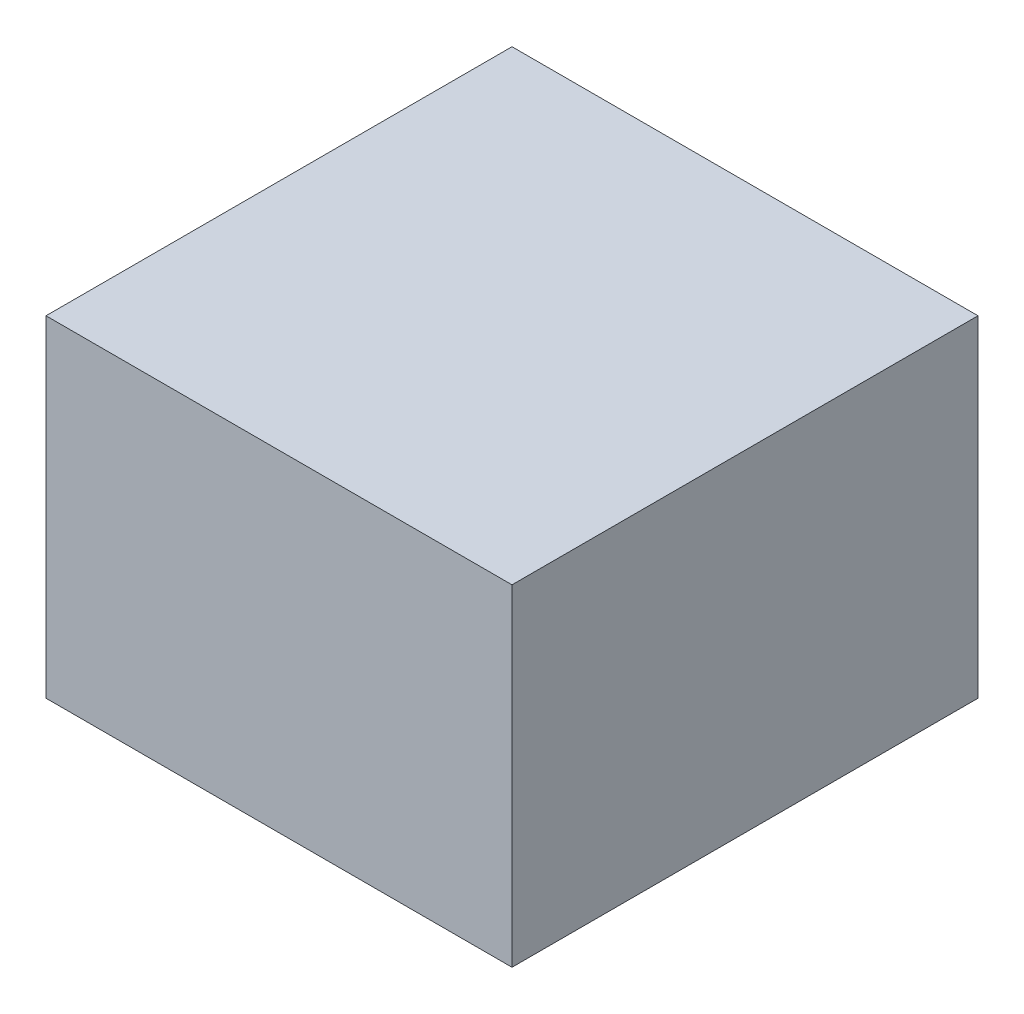
ISO-10303-21;
HEADER;
FILE_DESCRIPTION(('STEP AP214'),'2;1');
FILE_NAME('part.step','',(''),(''),'','','');
FILE_SCHEMA(('AUTOMOTIVE_DESIGN { 1 0 10303 214 1 1 1 1 }'));
ENDSEC;
DATA;
#1=APPLICATION_CONTEXT('core data for automotive mechanical design processes');
#2=APPLICATION_PROTOCOL_DEFINITION('international standard','automotive_design',2000,#1);
#3=PRODUCT_CONTEXT('',#1,'mechanical');
#4=PRODUCT('Part','Part','',(#3));
#5=PRODUCT_RELATED_PRODUCT_CATEGORY('part','',(#4));
#6=PRODUCT_DEFINITION_FORMATION('','',#4);
#7=PRODUCT_DEFINITION_CONTEXT('part definition',#1,'design');
#8=PRODUCT_DEFINITION('design','',#6,#7);
#9=PRODUCT_DEFINITION_SHAPE('','',#8);
#10=(LENGTH_UNIT() NAMED_UNIT(*) SI_UNIT(.MILLI.,.METRE.));
#11=(NAMED_UNIT(*) PLANE_ANGLE_UNIT() SI_UNIT($,.RADIAN.));
#12=(NAMED_UNIT(*) SI_UNIT($,.STERADIAN.) SOLID_ANGLE_UNIT());
#13=UNCERTAINTY_MEASURE_WITH_UNIT(LENGTH_MEASURE(1.E-05),#10,'distance_accuracy_value','');
#14=(GEOMETRIC_REPRESENTATION_CONTEXT(3) GLOBAL_UNCERTAINTY_ASSIGNED_CONTEXT((#13)) GLOBAL_UNIT_ASSIGNED_CONTEXT((#10,
#11,#12)) REPRESENTATION_CONTEXT('',''));
#15=CARTESIAN_POINT('',(0.,0.,0.));
#16=DIRECTION('',(0.,0.,1.));
#17=DIRECTION('',(1.,0.,0.));
#18=AXIS2_PLACEMENT_3D('',#15,#16,#17);
#19=CARTESIAN_POINT('',(18.5,26.3,18.5));
#20=DIRECTION('',(-1.,0.,0.));
#21=DIRECTION('',(0.,0.,1.));
#22=AXIS2_PLACEMENT_3D('',#19,#20,#21);
#23=PLANE('',#22);
#24=DIRECTION('',(0.,0.,-1.));
#25=VECTOR('',#24,1.);
#26=CARTESIAN_POINT('',(18.5,0.,18.5));
#27=LINE('',#26,#25);
#28=CARTESIAN_POINT('',(18.5,0.,18.5));
#29=VERTEX_POINT('',#28);
#30=CARTESIAN_POINT('',(18.5,0.,-18.5));
#31=VERTEX_POINT('',#30);
#32=EDGE_CURVE('E107',#29,#31,#27,.T.);
#33=ORIENTED_EDGE('',*,*,#32,.T.);
#34=DIRECTION('',(0.,-1.,0.));
#35=VECTOR('',#34,1.);
#36=CARTESIAN_POINT('',(18.5,26.3,-18.5));
#37=LINE('',#36,#35);
#38=CARTESIAN_POINT('',(18.5,26.3,-18.5));
#39=VERTEX_POINT('',#38);
#40=EDGE_CURVE('E11',#39,#31,#37,.T.);
#41=ORIENTED_EDGE('',*,*,#40,.F.);
#42=DIRECTION('',(0.,0.,-1.));
#43=VECTOR('',#42,1.);
#44=CARTESIAN_POINT('',(18.5,26.3,18.5));
#45=LINE('',#44,#43);
#46=CARTESIAN_POINT('',(18.5,26.3,18.5));
#47=VERTEX_POINT('',#46);
#48=EDGE_CURVE('E91',#47,#39,#45,.T.);
#49=ORIENTED_EDGE('',*,*,#48,.F.);
#50=DIRECTION('',(0.,-1.,0.));
#51=VECTOR('',#50,1.);
#52=CARTESIAN_POINT('',(18.5,26.3,18.5));
#53=LINE('',#52,#51);
#54=EDGE_CURVE('E103',#47,#29,#53,.T.);
#55=ORIENTED_EDGE('',*,*,#54,.T.);
#56=EDGE_LOOP('',(#33,#41,#49,#55));
#57=FACE_BOUND('',#56,.T.);
#58=ADVANCED_FACE('F39',(#57),#23,.F.);
#59=CARTESIAN_POINT('',(-18.5,26.3,-18.5));
#60=DIRECTION('',(0.,0.,1.));
#61=DIRECTION('',(1.,0.,0.));
#62=AXIS2_PLACEMENT_3D('',#59,#60,#61);
#63=PLANE('',#62);
#64=DIRECTION('',(-1.,0.,0.));
#65=VECTOR('',#64,1.);
#66=CARTESIAN_POINT('',(-18.5,0.,-18.5));
#67=LINE('',#66,#65);
#68=CARTESIAN_POINT('',(-18.5,0.,-18.5));
#69=VERTEX_POINT('',#68);
#70=EDGE_CURVE('E96',#31,#69,#67,.T.);
#71=ORIENTED_EDGE('',*,*,#70,.T.);
#72=DIRECTION('',(0.,-1.,0.));
#73=VECTOR('',#72,1.);
#74=CARTESIAN_POINT('',(-18.5,26.3,-18.5));
#75=LINE('',#74,#73);
#76=CARTESIAN_POINT('',(-18.5,26.3,-18.5));
#77=VERTEX_POINT('',#76);
#78=EDGE_CURVE('E48',#77,#69,#75,.T.);
#79=ORIENTED_EDGE('',*,*,#78,.F.);
#80=DIRECTION('',(-1.,0.,0.));
#81=VECTOR('',#80,1.);
#82=CARTESIAN_POINT('',(-18.5,26.3,-18.5));
#83=LINE('',#82,#81);
#84=EDGE_CURVE('E86',#39,#77,#83,.T.);
#85=ORIENTED_EDGE('',*,*,#84,.F.);
#86=ORIENTED_EDGE('',*,*,#40,.T.);
#87=EDGE_LOOP('',(#71,#79,#85,#86));
#88=FACE_BOUND('',#87,.T.);
#89=ADVANCED_FACE('F95',(#88),#63,.F.);
#90=CARTESIAN_POINT('',(-18.5,26.3,18.5));
#91=DIRECTION('',(1.,0.,0.));
#92=DIRECTION('',(0.,0.,-1.));
#93=AXIS2_PLACEMENT_3D('',#90,#91,#92);
#94=PLANE('',#93);
#95=DIRECTION('',(0.,0.,1.));
#96=VECTOR('',#95,1.);
#97=CARTESIAN_POINT('',(-18.5,0.,18.5));
#98=LINE('',#97,#96);
#99=CARTESIAN_POINT('',(-18.5,0.,18.5));
#100=VERTEX_POINT('',#99);
#101=EDGE_CURVE('E73',#69,#100,#98,.T.);
#102=ORIENTED_EDGE('',*,*,#101,.T.);
#103=DIRECTION('',(0.,-1.,0.));
#104=VECTOR('',#103,1.);
#105=CARTESIAN_POINT('',(-18.5,26.3,18.5));
#106=LINE('',#105,#104);
#107=CARTESIAN_POINT('',(-18.5,26.3,18.5));
#108=VERTEX_POINT('',#107);
#109=EDGE_CURVE('E98',#108,#100,#106,.T.);
#110=ORIENTED_EDGE('',*,*,#109,.F.);
#111=DIRECTION('',(0.,0.,1.));
#112=VECTOR('',#111,1.);
#113=CARTESIAN_POINT('',(-18.5,26.3,18.5));
#114=LINE('',#113,#112);
#115=EDGE_CURVE('E89',#77,#108,#114,.T.);
#116=ORIENTED_EDGE('',*,*,#115,.F.);
#117=ORIENTED_EDGE('',*,*,#78,.T.);
#118=EDGE_LOOP('',(#102,#110,#116,#117));
#119=FACE_BOUND('',#118,.T.);
#120=ADVANCED_FACE('F99',(#119),#94,.F.);
#121=CARTESIAN_POINT('',(-18.5,26.3,18.5));
#122=DIRECTION('',(0.,0.,-1.));
#123=DIRECTION('',(-1.,0.,0.));
#124=AXIS2_PLACEMENT_3D('',#121,#122,#123);
#125=PLANE('',#124);
#126=DIRECTION('',(1.,0.,0.));
#127=VECTOR('',#126,1.);
#128=CARTESIAN_POINT('',(-18.5,0.,18.5));
#129=LINE('',#128,#127);
#130=EDGE_CURVE('E79',#100,#29,#129,.T.);
#131=ORIENTED_EDGE('',*,*,#130,.T.);
#132=ORIENTED_EDGE('',*,*,#54,.F.);
#133=DIRECTION('',(1.,0.,0.));
#134=VECTOR('',#133,1.);
#135=CARTESIAN_POINT('',(-18.5,26.3,18.5));
#136=LINE('',#135,#134);
#137=EDGE_CURVE('E56',#108,#47,#136,.T.);
#138=ORIENTED_EDGE('',*,*,#137,.F.);
#139=ORIENTED_EDGE('',*,*,#109,.T.);
#140=EDGE_LOOP('',(#131,#132,#138,#139));
#141=FACE_BOUND('',#140,.T.);
#142=ADVANCED_FACE('F121',(#141),#125,.F.);
#143=CARTESIAN_POINT('',(0.,26.3,0.));
#144=DIRECTION('',(0.,-1.,0.));
#145=DIRECTION('',(0.,0.,-1.));
#146=AXIS2_PLACEMENT_3D('',#143,#144,#145);
#147=PLANE('',#146);
#148=ORIENTED_EDGE('',*,*,#48,.T.);
#149=ORIENTED_EDGE('',*,*,#84,.T.);
#150=ORIENTED_EDGE('',*,*,#115,.T.);
#151=ORIENTED_EDGE('',*,*,#137,.T.);
#152=EDGE_LOOP('',(#148,#149,#150,#151));
#153=FACE_BOUND('',#152,.T.);
#154=ADVANCED_FACE('F87',(#153),#147,.F.);
#155=CARTESIAN_POINT('',(0.,0.,0.));
#156=DIRECTION('',(0.,-1.,0.));
#157=DIRECTION('',(0.,0.,-1.));
#158=AXIS2_PLACEMENT_3D('',#155,#156,#157);
#159=PLANE('',#158);
#160=CARTESIAN_POINT('',(-14.2499999999992,0.,-14.25));
#161=DIRECTION('',(0.,-1.,0.));
#162=DIRECTION('',(0.,0.,-1.));
#163=AXIS2_PLACEMENT_3D('',#160,#161,#162);
#164=CIRCLE('',#163,1.00000000000042);
#165=CARTESIAN_POINT('',(-14.2499999999992,0.,-15.2500000000004));
#166=VERTEX_POINT('',#165);
#167=EDGE_CURVE('E136',#166,#166,#164,.T.);
#168=ORIENTED_EDGE('',*,*,#167,.F.);
#169=EDGE_LOOP('',(#168));
#170=FACE_BOUND('',#169,.T.);
#171=CARTESIAN_POINT('',(14.2500000000008,0.,-14.2499999999992));
#172=DIRECTION('',(0.,-1.,0.));
#173=DIRECTION('',(0.,0.,-1.));
#174=AXIS2_PLACEMENT_3D('',#171,#172,#173);
#175=CIRCLE('',#174,1.00000000000113);
#176=CARTESIAN_POINT('',(14.2500000000008,0.,-15.2500000000003));
#177=VERTEX_POINT('',#176);
#178=EDGE_CURVE('E144',#177,#177,#175,.T.);
#179=ORIENTED_EDGE('',*,*,#178,.F.);
#180=EDGE_LOOP('',(#179));
#181=FACE_BOUND('',#180,.T.);
#182=CARTESIAN_POINT('',(14.25,0.,14.2500000000008));
#183=DIRECTION('',(0.,-1.,0.));
#184=DIRECTION('',(0.,0.,-1.));
#185=AXIS2_PLACEMENT_3D('',#182,#183,#184);
#186=CIRCLE('',#185,1.00000000000084);
#187=CARTESIAN_POINT('',(14.25,0.,13.25));
#188=VERTEX_POINT('',#187);
#189=EDGE_CURVE('E152',#188,#188,#186,.T.);
#190=ORIENTED_EDGE('',*,*,#189,.F.);
#191=EDGE_LOOP('',(#190));
#192=FACE_BOUND('',#191,.T.);
#193=CARTESIAN_POINT('',(-14.25,0.,14.25));
#194=DIRECTION('',(0.,-1.,0.));
#195=DIRECTION('',(0.,0.,-1.));
#196=AXIS2_PLACEMENT_3D('',#193,#194,#195);
#197=CIRCLE('',#196,0.999999999999999);
#198=CARTESIAN_POINT('',(-14.25,0.,13.25));
#199=VERTEX_POINT('',#198);
#200=EDGE_CURVE('E128',#199,#199,#197,.T.);
#201=ORIENTED_EDGE('',*,*,#200,.F.);
#202=EDGE_LOOP('',(#201));
#203=FACE_BOUND('',#202,.T.);
#204=ORIENTED_EDGE('',*,*,#32,.F.);
#205=ORIENTED_EDGE('',*,*,#130,.F.);
#206=ORIENTED_EDGE('',*,*,#101,.F.);
#207=ORIENTED_EDGE('',*,*,#70,.F.);
#208=EDGE_LOOP('',(#204,#205,#206,#207));
#209=FACE_BOUND('',#208,.T.);
#210=ADVANCED_FACE('F124',(#170,#181,#192,#203,#209),#159,.T.);
#211=CARTESIAN_POINT('',(-14.25,8.,14.25));
#212=DIRECTION('',(0.,-1.,0.));
#213=DIRECTION('',(0.,0.,-1.));
#214=AXIS2_PLACEMENT_3D('',#211,#212,#213);
#215=CYLINDRICAL_SURFACE('',#214,0.999999999999999);
#216=CARTESIAN_POINT('',(-14.25,8.,14.25));
#217=DIRECTION('',(0.,-1.,0.));
#218=DIRECTION('',(0.,0.,-1.));
#219=AXIS2_PLACEMENT_3D('',#216,#217,#218);
#220=CIRCLE('',#219,0.999999999999999);
#221=CARTESIAN_POINT('',(-14.25,8.,13.25));
#222=VERTEX_POINT('',#221);
#223=EDGE_CURVE('E111',#222,#222,#220,.T.);
#224=ORIENTED_EDGE('',*,*,#223,.F.);
#225=EDGE_LOOP('',(#224));
#226=FACE_BOUND('',#225,.T.);
#227=ORIENTED_EDGE('',*,*,#200,.T.);
#228=EDGE_LOOP('',(#227));
#229=FACE_BOUND('',#228,.T.);
#230=ADVANCED_FACE('F171',(#226,#229),#215,.F.);
#231=CARTESIAN_POINT('',(-14.25,8.,14.25));
#232=DIRECTION('',(0.,-1.,0.));
#233=DIRECTION('',(0.,0.,-1.));
#234=AXIS2_PLACEMENT_3D('',#231,#232,#233);
#235=PLANE('',#234);
#236=ORIENTED_EDGE('',*,*,#223,.T.);
#237=EDGE_LOOP('',(#236));
#238=FACE_BOUND('',#237,.T.);
#239=ADVANCED_FACE('F165',(#238),#235,.T.);
#240=CARTESIAN_POINT('',(14.25,8.,14.2500000000008));
#241=DIRECTION('',(0.,-1.,0.));
#242=DIRECTION('',(0.,0.,-1.));
#243=AXIS2_PLACEMENT_3D('',#240,#241,#242);
#244=CYLINDRICAL_SURFACE('',#243,1.00000000000084);
#245=CARTESIAN_POINT('',(14.25,8.,14.2500000000008));
#246=DIRECTION('',(0.,-1.,0.));
#247=DIRECTION('',(0.,0.,-1.));
#248=AXIS2_PLACEMENT_3D('',#245,#246,#247);
#249=CIRCLE('',#248,1.00000000000084);
#250=CARTESIAN_POINT('',(14.25,8.,13.25));
#251=VERTEX_POINT('',#250);
#252=EDGE_CURVE('E132',#251,#251,#249,.T.);
#253=ORIENTED_EDGE('',*,*,#252,.F.);
#254=EDGE_LOOP('',(#253));
#255=FACE_BOUND('',#254,.T.);
#256=ORIENTED_EDGE('',*,*,#189,.T.);
#257=EDGE_LOOP('',(#256));
#258=FACE_BOUND('',#257,.T.);
#259=ADVANCED_FACE('F162',(#255,#258),#244,.F.);
#260=CARTESIAN_POINT('',(14.25,8.,14.2500000000008));
#261=DIRECTION('',(0.,-1.,0.));
#262=DIRECTION('',(0.,0.,-1.));
#263=AXIS2_PLACEMENT_3D('',#260,#261,#262);
#264=PLANE('',#263);
#265=ORIENTED_EDGE('',*,*,#252,.T.);
#266=EDGE_LOOP('',(#265));
#267=FACE_BOUND('',#266,.T.);
#268=ADVANCED_FACE('F160',(#267),#264,.T.);
#269=CARTESIAN_POINT('',(14.2500000000008,8.,-14.2499999999992));
#270=DIRECTION('',(0.,-1.,0.));
#271=DIRECTION('',(0.,0.,-1.));
#272=AXIS2_PLACEMENT_3D('',#269,#270,#271);
#273=CYLINDRICAL_SURFACE('',#272,1.00000000000113);
#274=CARTESIAN_POINT('',(14.2500000000008,8.,-14.2499999999992));
#275=DIRECTION('',(0.,-1.,0.));
#276=DIRECTION('',(0.,0.,-1.));
#277=AXIS2_PLACEMENT_3D('',#274,#275,#276);
#278=CIRCLE('',#277,1.00000000000113);
#279=CARTESIAN_POINT('',(14.2500000000008,8.,-15.2500000000003));
#280=VERTEX_POINT('',#279);
#281=EDGE_CURVE('E148',#280,#280,#278,.T.);
#282=ORIENTED_EDGE('',*,*,#281,.F.);
#283=EDGE_LOOP('',(#282));
#284=FACE_BOUND('',#283,.T.);
#285=ORIENTED_EDGE('',*,*,#178,.T.);
#286=EDGE_LOOP('',(#285));
#287=FACE_BOUND('',#286,.T.);
#288=ADVANCED_FACE('F230',(#284,#287),#273,.F.);
#289=CARTESIAN_POINT('',(14.2500000000008,8.,-14.2499999999992));
#290=DIRECTION('',(0.,-1.,0.));
#291=DIRECTION('',(0.,0.,-1.));
#292=AXIS2_PLACEMENT_3D('',#289,#290,#291);
#293=PLANE('',#292);
#294=ORIENTED_EDGE('',*,*,#281,.T.);
#295=EDGE_LOOP('',(#294));
#296=FACE_BOUND('',#295,.T.);
#297=ADVANCED_FACE('F239',(#296),#293,.T.);
#298=CARTESIAN_POINT('',(-14.2499999999992,8.,-14.25));
#299=DIRECTION('',(0.,-1.,0.));
#300=DIRECTION('',(0.,0.,-1.));
#301=AXIS2_PLACEMENT_3D('',#298,#299,#300);
#302=CYLINDRICAL_SURFACE('',#301,1.00000000000042);
#303=CARTESIAN_POINT('',(-14.2499999999992,8.,-14.25));
#304=DIRECTION('',(0.,-1.,0.));
#305=DIRECTION('',(0.,0.,-1.));
#306=AXIS2_PLACEMENT_3D('',#303,#304,#305);
#307=CIRCLE('',#306,1.00000000000042);
#308=CARTESIAN_POINT('',(-14.2499999999992,8.,-15.2500000000004));
#309=VERTEX_POINT('',#308);
#310=EDGE_CURVE('E140',#309,#309,#307,.T.);
#311=ORIENTED_EDGE('',*,*,#310,.F.);
#312=EDGE_LOOP('',(#311));
#313=FACE_BOUND('',#312,.T.);
#314=ORIENTED_EDGE('',*,*,#167,.T.);
#315=EDGE_LOOP('',(#314));
#316=FACE_BOUND('',#315,.T.);
#317=ADVANCED_FACE('F249',(#313,#316),#302,.F.);
#318=CARTESIAN_POINT('',(-14.2499999999992,8.,-14.25));
#319=DIRECTION('',(0.,-1.,0.));
#320=DIRECTION('',(0.,0.,-1.));
#321=AXIS2_PLACEMENT_3D('',#318,#319,#320);
#322=PLANE('',#321);
#323=ORIENTED_EDGE('',*,*,#310,.T.);
#324=EDGE_LOOP('',(#323));
#325=FACE_BOUND('',#324,.T.);
#326=ADVANCED_FACE('F259',(#325),#322,.T.);
#327=CLOSED_SHELL('',(#58,#89,#120,#142,#154,#210,#230,#239,#259,#268,#288,#297,#317,#326));
#328=MANIFOLD_SOLID_BREP('B2',#327);
#329=ADVANCED_BREP_SHAPE_REPRESENTATION('',(#18,#328),#14);
#330=SHAPE_DEFINITION_REPRESENTATION(#9,#329);
ENDSEC;
END-ISO-10303-21;
